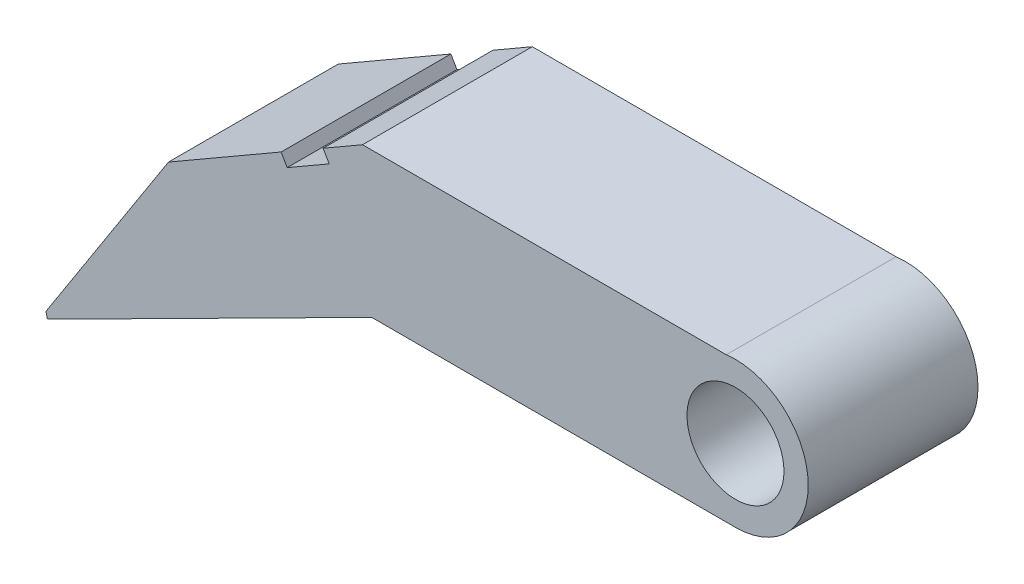
ISO-10303-21;
HEADER;
FILE_DESCRIPTION(('STEP AP214'),'2;1');
FILE_NAME('part.step','',(''),(''),'','','');
FILE_SCHEMA(('AUTOMOTIVE_DESIGN { 1 0 10303 214 1 1 1 1 }'));
ENDSEC;
DATA;
#1=APPLICATION_CONTEXT('core data for automotive mechanical design processes');
#2=APPLICATION_PROTOCOL_DEFINITION('international standard','automotive_design',2000,#1);
#3=PRODUCT_CONTEXT('',#1,'mechanical');
#4=PRODUCT('Part','Part','',(#3));
#5=PRODUCT_RELATED_PRODUCT_CATEGORY('part','',(#4));
#6=PRODUCT_DEFINITION_FORMATION('','',#4);
#7=PRODUCT_DEFINITION_CONTEXT('part definition',#1,'design');
#8=PRODUCT_DEFINITION('design','',#6,#7);
#9=PRODUCT_DEFINITION_SHAPE('','',#8);
#10=(LENGTH_UNIT() NAMED_UNIT(*) SI_UNIT(.MILLI.,.METRE.));
#11=(NAMED_UNIT(*) PLANE_ANGLE_UNIT() SI_UNIT($,.RADIAN.));
#12=(NAMED_UNIT(*) SI_UNIT($,.STERADIAN.) SOLID_ANGLE_UNIT());
#13=UNCERTAINTY_MEASURE_WITH_UNIT(LENGTH_MEASURE(1.E-05),#10,'distance_accuracy_value','');
#14=(GEOMETRIC_REPRESENTATION_CONTEXT(3) GLOBAL_UNCERTAINTY_ASSIGNED_CONTEXT((#13)) GLOBAL_UNIT_ASSIGNED_CONTEXT((#10,
#11,#12)) REPRESENTATION_CONTEXT('',''));
#15=CARTESIAN_POINT('',(0.,0.,0.));
#16=DIRECTION('',(0.,0.,1.));
#17=DIRECTION('',(1.,0.,0.));
#18=AXIS2_PLACEMENT_3D('',#15,#16,#17);
#19=CARTESIAN_POINT('',(-15.3782134718686,2.97606360310009,7.));
#20=DIRECTION('',(-0.500000000000001,0.866025403784438,0.));
#21=DIRECTION('',(-0.866025403784438,-0.500000000000001,0.));
#22=AXIS2_PLACEMENT_3D('',#19,#20,#21);
#23=PLANE('',#22);
#24=DIRECTION('',(0.,0.,-1.));
#25=VECTOR('',#24,1.);
#26=CARTESIAN_POINT('',(-18.7341896408181,1.03848985856316,7.));
#27=LINE('',#26,#25);
#28=CARTESIAN_POINT('',(-18.7341896408181,1.03848985856316,7.));
#29=VERTEX_POINT('',#28);
#30=CARTESIAN_POINT('',(-18.7341896408181,1.03848985856316,0.));
#31=VERTEX_POINT('',#30);
#32=EDGE_CURVE('E146',#29,#31,#27,.T.);
#33=ORIENTED_EDGE('',*,*,#32,.T.);
#34=DIRECTION('',(0.866025403784438,0.500000000000001,0.));
#35=VECTOR('',#34,1.);
#36=CARTESIAN_POINT('',(-15.3782134718686,2.97606360310009,0.));
#37=LINE('',#36,#35);
#38=CARTESIAN_POINT('',(-23.3782134718686,-1.64273855041693,0.));
#39=VERTEX_POINT('',#38);
#40=EDGE_CURVE('E175',#39,#31,#37,.T.);
#41=ORIENTED_EDGE('',*,*,#40,.F.);
#42=DIRECTION('',(0.,0.,-1.));
#43=VECTOR('',#42,1.);
#44=CARTESIAN_POINT('',(-23.3782134718686,-1.64273855041693,7.));
#45=LINE('',#44,#43);
#46=CARTESIAN_POINT('',(-23.3782134718686,-1.64273855041693,7.));
#47=VERTEX_POINT('',#46);
#48=EDGE_CURVE('E186',#47,#39,#45,.T.);
#49=ORIENTED_EDGE('',*,*,#48,.F.);
#50=DIRECTION('',(0.866025403784438,0.500000000000001,0.));
#51=VECTOR('',#50,1.);
#52=CARTESIAN_POINT('',(-15.3782134718686,2.97606360310009,7.));
#53=LINE('',#52,#51);
#54=EDGE_CURVE('E161',#47,#29,#53,.T.);
#55=ORIENTED_EDGE('',*,*,#54,.T.);
#56=EDGE_LOOP('',(#33,#41,#49,#55));
#57=FACE_BOUND('',#56,.T.);
#58=ADVANCED_FACE('F33',(#57),#23,.T.);
#59=CARTESIAN_POINT('',(0.,0.,7.));
#60=DIRECTION('',(0.,0.,1.));
#61=DIRECTION('',(1.,0.,0.));
#62=AXIS2_PLACEMENT_3D('',#59,#60,#61);
#63=PLANE('',#62);
#64=CARTESIAN_POINT('',(0.,0.,7.));
#65=DIRECTION('',(0.,0.,1.));
#66=DIRECTION('',(1.,0.,0.));
#67=AXIS2_PLACEMENT_3D('',#64,#65,#66);
#68=CIRCLE('',#67,3.);
#69=CARTESIAN_POINT('',(0.,-3.,7.));
#70=VERTEX_POINT('',#69);
#71=CARTESIAN_POINT('',(-0.378213471868627,2.97606360310009,7.));
#72=VERTEX_POINT('',#71);
#73=EDGE_CURVE('E199',#70,#72,#68,.T.);
#74=ORIENTED_EDGE('',*,*,#73,.T.);
#75=DIRECTION('',(1.,0.,0.));
#76=VECTOR('',#75,1.);
#77=CARTESIAN_POINT('',(-0.378213471868627,2.97606360310009,7.));
#78=LINE('',#77,#76);
#79=CARTESIAN_POINT('',(-15.3782134718686,2.97606360310009,7.));
#80=VERTEX_POINT('',#79);
#81=EDGE_CURVE('E164',#80,#72,#78,.T.);
#82=ORIENTED_EDGE('',*,*,#81,.F.);
#83=CARTESIAN_POINT('',(-17.0021388332492,2.03848985856315,7.));
#84=VERTEX_POINT('',#83);
#85=EDGE_CURVE('E137',#84,#80,#53,.T.);
#86=ORIENTED_EDGE('',*,*,#85,.F.);
#87=DIRECTION('',(0.499999999999999,-0.866025403784439,0.));
#88=VECTOR('',#87,1.);
#89=CARTESIAN_POINT('',(-17.0021388332492,2.03848985856315,7.));
#90=LINE('',#89,#88);
#91=CARTESIAN_POINT('',(-16.7521388332492,1.60547715667093,7.));
#92=VERTEX_POINT('',#91);
#93=EDGE_CURVE('E48',#84,#92,#90,.T.);
#94=ORIENTED_EDGE('',*,*,#93,.T.);
#95=DIRECTION('',(-0.866025403784439,-0.5,0.));
#96=VECTOR('',#95,1.);
#97=CARTESIAN_POINT('',(-16.7521388332492,1.60547715667093,7.));
#98=LINE('',#97,#96);
#99=CARTESIAN_POINT('',(-18.4841896408181,0.605477156670933,7.));
#100=VERTEX_POINT('',#99);
#101=EDGE_CURVE('E125',#92,#100,#98,.T.);
#102=ORIENTED_EDGE('',*,*,#101,.T.);
#103=DIRECTION('',(-0.500000000000008,0.866025403784434,0.));
#104=VECTOR('',#103,1.);
#105=CARTESIAN_POINT('',(-18.4841896408181,0.605477156670933,7.));
#106=LINE('',#105,#104);
#107=EDGE_CURVE('E130',#100,#29,#106,.T.);
#108=ORIENTED_EDGE('',*,*,#107,.T.);
#109=ORIENTED_EDGE('',*,*,#54,.F.);
#110=DIRECTION('',(0.540869070020687,0.841106800052739,0.));
#111=VECTOR('',#110,1.);
#112=CARTESIAN_POINT('',(-23.3782134718686,-1.64273855041693,7.));
#113=LINE('',#112,#111);
#114=CARTESIAN_POINT('',(-28.4291370223951,-9.4974419904415,7.));
#115=VERTEX_POINT('',#114);
#116=EDGE_CURVE('E159',#115,#47,#113,.T.);
#117=ORIENTED_EDGE('',*,*,#116,.F.);
#118=DIRECTION('',(-0.212300134873707,0.977204509165101,0.));
#119=VECTOR('',#118,1.);
#120=CARTESIAN_POINT('',(-29.118142995225,-6.32598972597836,7.));
#121=LINE('',#120,#119);
#122=CARTESIAN_POINT('',(-28.3735390922313,-9.75335585544542,7.));
#123=VERTEX_POINT('',#122);
#124=EDGE_CURVE('E11',#115,#123,#121,.F.);
#125=ORIENTED_EDGE('',*,*,#124,.T.);
#126=DIRECTION('',(-0.892642351896187,-0.450765606054015,0.));
#127=VECTOR('',#126,1.);
#128=CARTESIAN_POINT('',(-28.6995715574055,-9.91799539046788,7.));
#129=LINE('',#128,#127);
#130=CARTESIAN_POINT('',(-15.,-3.,7.));
#131=VERTEX_POINT('',#130);
#132=EDGE_CURVE('E155',#131,#123,#129,.T.);
#133=ORIENTED_EDGE('',*,*,#132,.F.);
#134=DIRECTION('',(-1.,0.,0.));
#135=VECTOR('',#134,1.);
#136=CARTESIAN_POINT('',(0.,-3.,7.));
#137=LINE('',#136,#135);
#138=EDGE_CURVE('E152',#70,#131,#137,.T.);
#139=ORIENTED_EDGE('',*,*,#138,.F.);
#140=EDGE_LOOP('',(#74,#82,#86,#94,#102,#108,#109,#117,#125,#133,#139));
#141=FACE_BOUND('',#140,.T.);
#142=CARTESIAN_POINT('',(0.,0.,7.));
#143=DIRECTION('',(0.,0.,1.));
#144=DIRECTION('',(1.,0.,0.));
#145=AXIS2_PLACEMENT_3D('',#142,#143,#144);
#146=CIRCLE('',#145,2.);
#147=CARTESIAN_POINT('',(2.,0.,7.));
#148=VERTEX_POINT('',#147);
#149=EDGE_CURVE('E193',#148,#148,#146,.T.);
#150=ORIENTED_EDGE('',*,*,#149,.F.);
#151=EDGE_LOOP('',(#150));
#152=FACE_BOUND('',#151,.T.);
#153=ADVANCED_FACE('F134',(#141,#152),#63,.T.);
#154=CARTESIAN_POINT('',(0.,0.,0.));
#155=DIRECTION('',(0.,0.,1.));
#156=DIRECTION('',(1.,0.,0.));
#157=AXIS2_PLACEMENT_3D('',#154,#155,#156);
#158=PLANE('',#157);
#159=DIRECTION('',(1.,0.,0.));
#160=VECTOR('',#159,1.);
#161=CARTESIAN_POINT('',(-0.378213471868627,2.97606360310009,0.));
#162=LINE('',#161,#160);
#163=CARTESIAN_POINT('',(-15.3782134718686,2.97606360310009,0.));
#164=VERTEX_POINT('',#163);
#165=CARTESIAN_POINT('',(-0.378213471868628,2.97606360310009,0.));
#166=VERTEX_POINT('',#165);
#167=EDGE_CURVE('E156',#164,#166,#162,.T.);
#168=ORIENTED_EDGE('',*,*,#167,.T.);
#169=CARTESIAN_POINT('',(0.,0.,0.));
#170=DIRECTION('',(0.,0.,1.));
#171=DIRECTION('',(1.,0.,0.));
#172=AXIS2_PLACEMENT_3D('',#169,#170,#171);
#173=CIRCLE('',#172,3.);
#174=CARTESIAN_POINT('',(0.,-3.,0.));
#175=VERTEX_POINT('',#174);
#176=EDGE_CURVE('E196',#175,#166,#173,.T.);
#177=ORIENTED_EDGE('',*,*,#176,.F.);
#178=DIRECTION('',(-1.,0.,0.));
#179=VECTOR('',#178,1.);
#180=CARTESIAN_POINT('',(0.,-3.,0.));
#181=LINE('',#180,#179);
#182=CARTESIAN_POINT('',(-15.,-3.,0.));
#183=VERTEX_POINT('',#182);
#184=EDGE_CURVE('E149',#175,#183,#181,.T.);
#185=ORIENTED_EDGE('',*,*,#184,.T.);
#186=DIRECTION('',(-0.892642351896187,-0.450765606054015,0.));
#187=VECTOR('',#186,1.);
#188=CARTESIAN_POINT('',(-28.6995715574055,-9.91799539046788,0.));
#189=LINE('',#188,#187);
#190=CARTESIAN_POINT('',(-28.3735390922313,-9.75335585544542,0.));
#191=VERTEX_POINT('',#190);
#192=EDGE_CURVE('E169',#183,#191,#189,.T.);
#193=ORIENTED_EDGE('',*,*,#192,.T.);
#194=DIRECTION('',(0.212300134873707,-0.977204509165101,0.));
#195=VECTOR('',#194,1.);
#196=CARTESIAN_POINT('',(-28.3735390922313,-9.75335585544542,0.));
#197=LINE('',#196,#195);
#198=CARTESIAN_POINT('',(-28.4291370223951,-9.4974419904415,0.));
#199=VERTEX_POINT('',#198);
#200=EDGE_CURVE('E206',#191,#199,#197,.F.);
#201=ORIENTED_EDGE('',*,*,#200,.T.);
#202=DIRECTION('',(0.540869070020687,0.841106800052739,0.));
#203=VECTOR('',#202,1.);
#204=CARTESIAN_POINT('',(-23.3782134718686,-1.64273855041693,0.));
#205=LINE('',#204,#203);
#206=EDGE_CURVE('E172',#199,#39,#205,.T.);
#207=ORIENTED_EDGE('',*,*,#206,.T.);
#208=ORIENTED_EDGE('',*,*,#40,.T.);
#209=DIRECTION('',(-0.500000000000008,0.866025403784434,0.));
#210=VECTOR('',#209,1.);
#211=CARTESIAN_POINT('',(-18.4841896408181,0.605477156670933,0.));
#212=LINE('',#211,#210);
#213=CARTESIAN_POINT('',(-18.4841896408181,0.605477156670933,0.));
#214=VERTEX_POINT('',#213);
#215=EDGE_CURVE('E138',#214,#31,#212,.T.);
#216=ORIENTED_EDGE('',*,*,#215,.F.);
#217=DIRECTION('',(-0.866025403784439,-0.5,0.));
#218=VECTOR('',#217,1.);
#219=CARTESIAN_POINT('',(-16.7521388332492,1.60547715667093,0.));
#220=LINE('',#219,#218);
#221=CARTESIAN_POINT('',(-16.7521388332492,1.60547715667093,0.));
#222=VERTEX_POINT('',#221);
#223=EDGE_CURVE('E140',#222,#214,#220,.T.);
#224=ORIENTED_EDGE('',*,*,#223,.F.);
#225=DIRECTION('',(0.499999999999999,-0.866025403784439,0.));
#226=VECTOR('',#225,1.);
#227=CARTESIAN_POINT('',(-17.0021388332492,2.03848985856315,0.));
#228=LINE('',#227,#226);
#229=CARTESIAN_POINT('',(-17.0021388332492,2.03848985856315,0.));
#230=VERTEX_POINT('',#229);
#231=EDGE_CURVE('E117',#230,#222,#228,.T.);
#232=ORIENTED_EDGE('',*,*,#231,.F.);
#233=EDGE_CURVE('E174',#230,#164,#37,.T.);
#234=ORIENTED_EDGE('',*,*,#233,.T.);
#235=EDGE_LOOP('',(#168,#177,#185,#193,#201,#207,#208,#216,#224,#232,#234));
#236=FACE_BOUND('',#235,.T.);
#237=CARTESIAN_POINT('',(0.,0.,0.));
#238=DIRECTION('',(0.,0.,1.));
#239=DIRECTION('',(1.,0.,0.));
#240=AXIS2_PLACEMENT_3D('',#237,#238,#239);
#241=CIRCLE('',#240,2.);
#242=CARTESIAN_POINT('',(2.,0.,0.));
#243=VERTEX_POINT('',#242);
#244=EDGE_CURVE('E182',#243,#243,#241,.T.);
#245=ORIENTED_EDGE('',*,*,#244,.T.);
#246=EDGE_LOOP('',(#245));
#247=FACE_BOUND('',#246,.T.);
#248=ADVANCED_FACE('F208',(#236,#247),#158,.F.);
#249=CARTESIAN_POINT('',(0.,0.,7.));
#250=DIRECTION('',(0.,0.,-1.));
#251=DIRECTION('',(-1.,0.,0.));
#252=AXIS2_PLACEMENT_3D('',#249,#250,#251);
#253=CYLINDRICAL_SURFACE('',#252,3.);
#254=ORIENTED_EDGE('',*,*,#176,.T.);
#255=DIRECTION('',(0.,0.,-1.));
#256=VECTOR('',#255,1.);
#257=CARTESIAN_POINT('',(-0.378213471868627,2.97606360310009,7.));
#258=LINE('',#257,#256);
#259=EDGE_CURVE('E179',#72,#166,#258,.T.);
#260=ORIENTED_EDGE('',*,*,#259,.F.);
#261=ORIENTED_EDGE('',*,*,#73,.F.);
#262=DIRECTION('',(0.,0.,-1.));
#263=VECTOR('',#262,1.);
#264=CARTESIAN_POINT('',(0.,-3.,7.));
#265=LINE('',#264,#263);
#266=EDGE_CURVE('E166',#70,#175,#265,.T.);
#267=ORIENTED_EDGE('',*,*,#266,.T.);
#268=EDGE_LOOP('',(#254,#260,#261,#267));
#269=FACE_BOUND('',#268,.T.);
#270=ADVANCED_FACE('F228',(#269),#253,.T.);
#271=CARTESIAN_POINT('',(0.,0.,7.));
#272=DIRECTION('',(0.,0.,-1.));
#273=DIRECTION('',(-1.,0.,0.));
#274=AXIS2_PLACEMENT_3D('',#271,#272,#273);
#275=CYLINDRICAL_SURFACE('',#274,2.);
#276=ORIENTED_EDGE('',*,*,#149,.T.);
#277=EDGE_LOOP('',(#276));
#278=FACE_BOUND('',#277,.T.);
#279=ORIENTED_EDGE('',*,*,#244,.F.);
#280=EDGE_LOOP('',(#279));
#281=FACE_BOUND('',#280,.T.);
#282=ADVANCED_FACE('F254',(#278,#281),#275,.F.);
#283=CARTESIAN_POINT('',(-0.378213471868627,2.97606360310009,7.));
#284=DIRECTION('',(0.,1.,0.));
#285=DIRECTION('',(-1.,0.,0.));
#286=AXIS2_PLACEMENT_3D('',#283,#284,#285);
#287=PLANE('',#286);
#288=ORIENTED_EDGE('',*,*,#81,.T.);
#289=ORIENTED_EDGE('',*,*,#259,.T.);
#290=ORIENTED_EDGE('',*,*,#167,.F.);
#291=DIRECTION('',(0.,0.,-1.));
#292=VECTOR('',#291,1.);
#293=CARTESIAN_POINT('',(-15.3782134718686,2.97606360310009,7.));
#294=LINE('',#293,#292);
#295=EDGE_CURVE('E183',#80,#164,#294,.T.);
#296=ORIENTED_EDGE('',*,*,#295,.F.);
#297=EDGE_LOOP('',(#288,#289,#290,#296));
#298=FACE_BOUND('',#297,.T.);
#299=ADVANCED_FACE('F231',(#298),#287,.T.);
#300=DIRECTION('',(0.,0.,-1.));
#301=VECTOR('',#300,1.);
#302=CARTESIAN_POINT('',(-17.0021388332492,2.03848985856315,7.));
#303=LINE('',#302,#301);
#304=EDGE_CURVE('E122',#84,#230,#303,.T.);
#305=ORIENTED_EDGE('',*,*,#304,.F.);
#306=ORIENTED_EDGE('',*,*,#85,.T.);
#307=ORIENTED_EDGE('',*,*,#295,.T.);
#308=ORIENTED_EDGE('',*,*,#233,.F.);
#309=EDGE_LOOP('',(#305,#306,#307,#308));
#310=FACE_BOUND('',#309,.T.);
#311=ADVANCED_FACE('F235',(#310),#23,.T.);
#312=CARTESIAN_POINT('',(-23.3782134718686,-1.64273855041693,7.));
#313=DIRECTION('',(-0.841106800052739,0.540869070020687,0.));
#314=DIRECTION('',(-0.540869070020687,-0.841106800052739,0.));
#315=AXIS2_PLACEMENT_3D('',#312,#313,#314);
#316=PLANE('',#315);
#317=ORIENTED_EDGE('',*,*,#206,.F.);
#318=DIRECTION('',(0.,0.,1.));
#319=VECTOR('',#318,1.);
#320=CARTESIAN_POINT('',(-28.4291370223951,-9.4974419904415,7.));
#321=LINE('',#320,#319);
#322=EDGE_CURVE('E41',#199,#115,#321,.T.);
#323=ORIENTED_EDGE('',*,*,#322,.T.);
#324=ORIENTED_EDGE('',*,*,#116,.T.);
#325=ORIENTED_EDGE('',*,*,#48,.T.);
#326=EDGE_LOOP('',(#317,#323,#324,#325));
#327=FACE_BOUND('',#326,.T.);
#328=ADVANCED_FACE('F213',(#327),#316,.T.);
#329=CARTESIAN_POINT('',(-28.6995715574055,-9.91799539046788,7.));
#330=DIRECTION('',(0.450765606054015,-0.892642351896187,0.));
#331=DIRECTION('',(0.892642351896187,0.450765606054015,0.));
#332=AXIS2_PLACEMENT_3D('',#329,#330,#331);
#333=PLANE('',#332);
#334=ORIENTED_EDGE('',*,*,#132,.T.);
#335=DIRECTION('',(0.,0.,-1.));
#336=VECTOR('',#335,1.);
#337=CARTESIAN_POINT('',(-28.3735390922313,-9.75335585544542,7.));
#338=LINE('',#337,#336);
#339=EDGE_CURVE('E201',#123,#191,#338,.T.);
#340=ORIENTED_EDGE('',*,*,#339,.T.);
#341=ORIENTED_EDGE('',*,*,#192,.F.);
#342=DIRECTION('',(0.,0.,-1.));
#343=VECTOR('',#342,1.);
#344=CARTESIAN_POINT('',(-15.,-3.,7.));
#345=LINE('',#344,#343);
#346=EDGE_CURVE('E189',#131,#183,#345,.T.);
#347=ORIENTED_EDGE('',*,*,#346,.F.);
#348=EDGE_LOOP('',(#334,#340,#341,#347));
#349=FACE_BOUND('',#348,.T.);
#350=ADVANCED_FACE('F221',(#349),#333,.T.);
#351=CARTESIAN_POINT('',(0.,-3.,7.));
#352=DIRECTION('',(0.,-1.,0.));
#353=DIRECTION('',(0.,0.,-1.));
#354=AXIS2_PLACEMENT_3D('',#351,#352,#353);
#355=PLANE('',#354);
#356=ORIENTED_EDGE('',*,*,#184,.F.);
#357=ORIENTED_EDGE('',*,*,#266,.F.);
#358=ORIENTED_EDGE('',*,*,#138,.T.);
#359=ORIENTED_EDGE('',*,*,#346,.T.);
#360=EDGE_LOOP('',(#356,#357,#358,#359));
#361=FACE_BOUND('',#360,.T.);
#362=ADVANCED_FACE('F224',(#361),#355,.T.);
#363=CARTESIAN_POINT('',(-28.3735390922313,-9.75335585544542,7.));
#364=DIRECTION('',(0.977204509165101,0.212300134873707,0.));
#365=DIRECTION('',(0.,0.,-1.));
#366=AXIS2_PLACEMENT_3D('',#363,#364,#365);
#367=PLANE('',#366);
#368=ORIENTED_EDGE('',*,*,#124,.F.);
#369=ORIENTED_EDGE('',*,*,#322,.F.);
#370=ORIENTED_EDGE('',*,*,#200,.F.);
#371=ORIENTED_EDGE('',*,*,#339,.F.);
#372=EDGE_LOOP('',(#368,#369,#370,#371));
#373=FACE_BOUND('',#372,.T.);
#374=ADVANCED_FACE('F35',(#373),#367,.F.);
#375=CARTESIAN_POINT('',(-18.4841896408181,0.605477156670933,7.));
#376=DIRECTION('',(-0.866025403784434,-0.500000000000008,0.));
#377=DIRECTION('',(0.500000000000008,-0.866025403784434,0.));
#378=AXIS2_PLACEMENT_3D('',#375,#376,#377);
#379=PLANE('',#378);
#380=ORIENTED_EDGE('',*,*,#215,.T.);
#381=ORIENTED_EDGE('',*,*,#32,.F.);
#382=ORIENTED_EDGE('',*,*,#107,.F.);
#383=DIRECTION('',(0.,0.,-1.));
#384=VECTOR('',#383,1.);
#385=CARTESIAN_POINT('',(-18.4841896408181,0.605477156670933,7.));
#386=LINE('',#385,#384);
#387=EDGE_CURVE('E121',#100,#214,#386,.T.);
#388=ORIENTED_EDGE('',*,*,#387,.T.);
#389=EDGE_LOOP('',(#380,#381,#382,#388));
#390=FACE_BOUND('',#389,.T.);
#391=ADVANCED_FACE('F238',(#390),#379,.F.);
#392=CARTESIAN_POINT('',(-16.7521388332492,1.60547715667093,7.));
#393=DIRECTION('',(0.5,-0.866025403784439,0.));
#394=DIRECTION('',(0.866025403784439,0.5,0.));
#395=AXIS2_PLACEMENT_3D('',#392,#393,#394);
#396=PLANE('',#395);
#397=ORIENTED_EDGE('',*,*,#223,.T.);
#398=ORIENTED_EDGE('',*,*,#387,.F.);
#399=ORIENTED_EDGE('',*,*,#101,.F.);
#400=DIRECTION('',(0.,0.,-1.));
#401=VECTOR('',#400,1.);
#402=CARTESIAN_POINT('',(-16.7521388332492,1.60547715667093,7.));
#403=LINE('',#402,#401);
#404=EDGE_CURVE('E113',#92,#222,#403,.T.);
#405=ORIENTED_EDGE('',*,*,#404,.T.);
#406=EDGE_LOOP('',(#397,#398,#399,#405));
#407=FACE_BOUND('',#406,.T.);
#408=ADVANCED_FACE('F126',(#407),#396,.F.);
#409=CARTESIAN_POINT('',(-17.0021388332492,2.03848985856315,7.));
#410=DIRECTION('',(0.866025403784439,0.499999999999999,0.));
#411=DIRECTION('',(-0.499999999999999,0.86602540378444,0.));
#412=AXIS2_PLACEMENT_3D('',#409,#410,#411);
#413=PLANE('',#412);
#414=ORIENTED_EDGE('',*,*,#231,.T.);
#415=ORIENTED_EDGE('',*,*,#404,.F.);
#416=ORIENTED_EDGE('',*,*,#93,.F.);
#417=ORIENTED_EDGE('',*,*,#304,.T.);
#418=EDGE_LOOP('',(#414,#415,#416,#417));
#419=FACE_BOUND('',#418,.T.);
#420=ADVANCED_FACE('F115',(#419),#413,.F.);
#421=CLOSED_SHELL('',(#58,#153,#248,#270,#282,#299,#311,#328,#350,#362,#374,#391,#408,#420));
#422=MANIFOLD_SOLID_BREP('B2',#421);
#423=ADVANCED_BREP_SHAPE_REPRESENTATION('',(#18,#422),#14);
#424=SHAPE_DEFINITION_REPRESENTATION(#9,#423);
ENDSEC;
END-ISO-10303-21;
